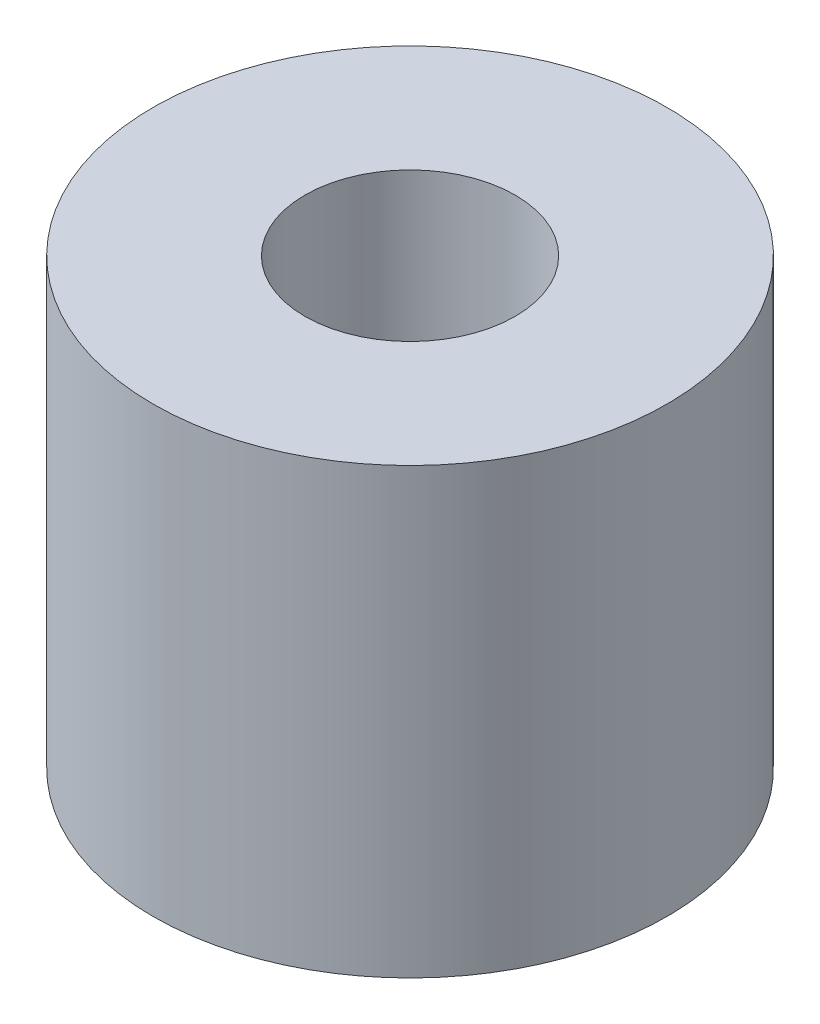
ISO-10303-21;
HEADER;
FILE_DESCRIPTION(('STEP AP214'),'2;1');
FILE_NAME('part.step','',(''),(''),'','','');
FILE_SCHEMA(('AUTOMOTIVE_DESIGN { 1 0 10303 214 1 1 1 1 }'));
ENDSEC;
DATA;
#1=APPLICATION_CONTEXT('core data for automotive mechanical design processes');
#2=APPLICATION_PROTOCOL_DEFINITION('international standard','automotive_design',2000,#1);
#3=PRODUCT_CONTEXT('',#1,'mechanical');
#4=PRODUCT('Part','Part','',(#3));
#5=PRODUCT_RELATED_PRODUCT_CATEGORY('part','',(#4));
#6=PRODUCT_DEFINITION_FORMATION('','',#4);
#7=PRODUCT_DEFINITION_CONTEXT('part definition',#1,'design');
#8=PRODUCT_DEFINITION('design','',#6,#7);
#9=PRODUCT_DEFINITION_SHAPE('','',#8);
#10=(LENGTH_UNIT() NAMED_UNIT(*) SI_UNIT(.MILLI.,.METRE.));
#11=(NAMED_UNIT(*) PLANE_ANGLE_UNIT() SI_UNIT($,.RADIAN.));
#12=(NAMED_UNIT(*) SI_UNIT($,.STERADIAN.) SOLID_ANGLE_UNIT());
#13=UNCERTAINTY_MEASURE_WITH_UNIT(LENGTH_MEASURE(1.E-05),#10,'distance_accuracy_value','');
#14=(GEOMETRIC_REPRESENTATION_CONTEXT(3) GLOBAL_UNCERTAINTY_ASSIGNED_CONTEXT((#13)) GLOBAL_UNIT_ASSIGNED_CONTEXT((#10,
#11,#12)) REPRESENTATION_CONTEXT('',''));
#15=CARTESIAN_POINT('',(0.,0.,0.));
#16=DIRECTION('',(0.,0.,1.));
#17=DIRECTION('',(1.,0.,0.));
#18=AXIS2_PLACEMENT_3D('',#15,#16,#17);
#19=CARTESIAN_POINT('',(0.,19.,0.));
#20=DIRECTION('',(0.,1.,0.));
#21=DIRECTION('',(0.,0.,1.));
#22=AXIS2_PLACEMENT_3D('',#19,#20,#21);
#23=PLANE('',#22);
#24=CARTESIAN_POINT('',(0.,19.,0.));
#25=DIRECTION('',(0.,1.,0.));
#26=DIRECTION('',(0.,0.,1.));
#27=AXIS2_PLACEMENT_3D('',#24,#25,#26);
#28=CIRCLE('',#27,11.);
#29=CARTESIAN_POINT('',(0.,19.,11.));
#30=VERTEX_POINT('',#29);
#31=EDGE_CURVE('E12',#30,#30,#28,.T.);
#32=ORIENTED_EDGE('',*,*,#31,.T.);
#33=EDGE_LOOP('',(#32));
#34=FACE_BOUND('',#33,.T.);
#35=CARTESIAN_POINT('',(0.,19.,0.));
#36=DIRECTION('',(0.,1.,0.));
#37=DIRECTION('',(0.,0.,1.));
#38=AXIS2_PLACEMENT_3D('',#35,#36,#37);
#39=CIRCLE('',#38,4.5);
#40=CARTESIAN_POINT('',(0.,19.,4.5));
#41=VERTEX_POINT('',#40);
#42=EDGE_CURVE('E55',#41,#41,#39,.T.);
#43=ORIENTED_EDGE('',*,*,#42,.F.);
#44=EDGE_LOOP('',(#43));
#45=FACE_BOUND('',#44,.T.);
#46=ADVANCED_FACE('F44',(#34,#45),#23,.T.);
#47=CARTESIAN_POINT('',(0.,0.,0.));
#48=DIRECTION('',(0.,1.,0.));
#49=DIRECTION('',(0.,0.,1.));
#50=AXIS2_PLACEMENT_3D('',#47,#48,#49);
#51=PLANE('',#50);
#52=CARTESIAN_POINT('',(0.,0.,0.));
#53=DIRECTION('',(0.,1.,0.));
#54=DIRECTION('',(0.,0.,1.));
#55=AXIS2_PLACEMENT_3D('',#52,#53,#54);
#56=CIRCLE('',#55,11.);
#57=CARTESIAN_POINT('',(0.,0.,11.));
#58=VERTEX_POINT('',#57);
#59=EDGE_CURVE('E48',#58,#58,#56,.T.);
#60=ORIENTED_EDGE('',*,*,#59,.F.);
#61=EDGE_LOOP('',(#60));
#62=FACE_BOUND('',#61,.T.);
#63=CARTESIAN_POINT('',(0.,0.,0.));
#64=DIRECTION('',(0.,1.,0.));
#65=DIRECTION('',(0.,0.,1.));
#66=AXIS2_PLACEMENT_3D('',#63,#64,#65);
#67=CIRCLE('',#66,4.5);
#68=CARTESIAN_POINT('',(0.,0.,4.5));
#69=VERTEX_POINT('',#68);
#70=EDGE_CURVE('E57',#69,#69,#67,.T.);
#71=ORIENTED_EDGE('',*,*,#70,.T.);
#72=EDGE_LOOP('',(#71));
#73=FACE_BOUND('',#72,.T.);
#74=ADVANCED_FACE('F67',(#62,#73),#51,.F.);
#75=CARTESIAN_POINT('',(0.,19.,0.));
#76=DIRECTION('',(0.,-1.,0.));
#77=DIRECTION('',(0.,0.,-1.));
#78=AXIS2_PLACEMENT_3D('',#75,#76,#77);
#79=CYLINDRICAL_SURFACE('',#78,11.);
#80=ORIENTED_EDGE('',*,*,#31,.F.);
#81=EDGE_LOOP('',(#80));
#82=FACE_BOUND('',#81,.T.);
#83=ORIENTED_EDGE('',*,*,#59,.T.);
#84=EDGE_LOOP('',(#83));
#85=FACE_BOUND('',#84,.T.);
#86=ADVANCED_FACE('F46',(#82,#85),#79,.T.);
#87=CARTESIAN_POINT('',(0.,19.,0.));
#88=DIRECTION('',(0.,-1.,0.));
#89=DIRECTION('',(0.,0.,-1.));
#90=AXIS2_PLACEMENT_3D('',#87,#88,#89);
#91=CYLINDRICAL_SURFACE('',#90,4.5);
#92=ORIENTED_EDGE('',*,*,#42,.T.);
#93=EDGE_LOOP('',(#92));
#94=FACE_BOUND('',#93,.T.);
#95=ORIENTED_EDGE('',*,*,#70,.F.);
#96=EDGE_LOOP('',(#95));
#97=FACE_BOUND('',#96,.T.);
#98=ADVANCED_FACE('F63',(#94,#97),#91,.F.);
#99=CLOSED_SHELL('',(#46,#74,#86,#98));
#100=MANIFOLD_SOLID_BREP('B2',#99);
#101=ADVANCED_BREP_SHAPE_REPRESENTATION('',(#18,#100),#14);
#102=SHAPE_DEFINITION_REPRESENTATION(#9,#101);
ENDSEC;
END-ISO-10303-21;
